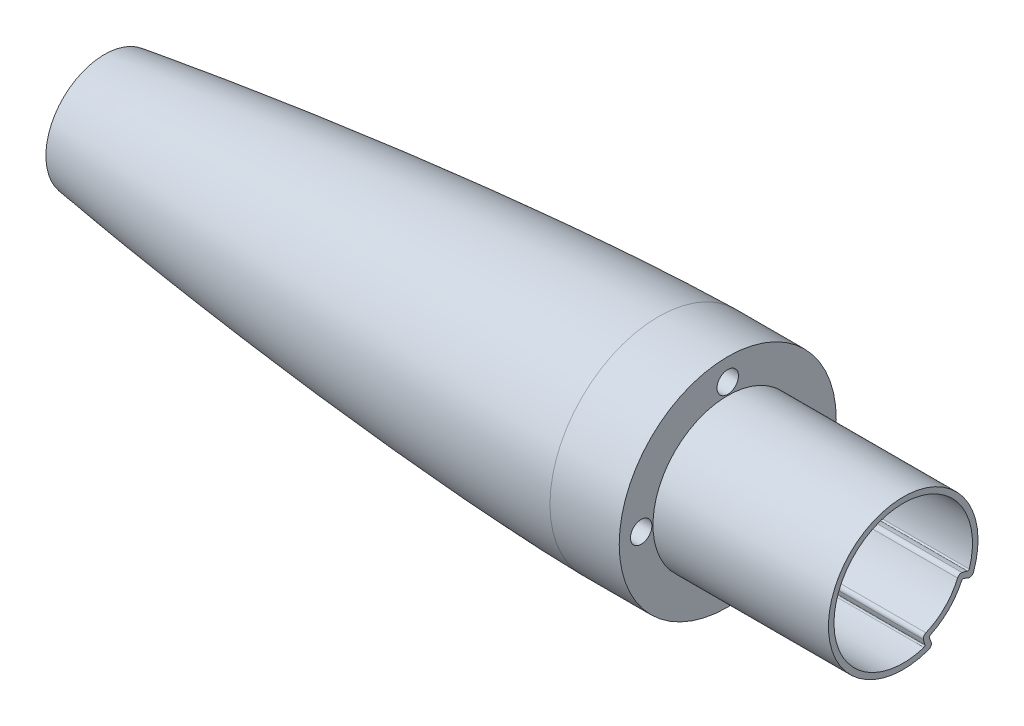
ISO-10303-21;
HEADER;
FILE_DESCRIPTION(('STEP AP214'),'2;1');
FILE_NAME('part.step','',(''),(''),'','','');
FILE_SCHEMA(('AUTOMOTIVE_DESIGN { 1 0 10303 214 1 1 1 1 }'));
ENDSEC;
DATA;
#1=APPLICATION_CONTEXT('core data for automotive mechanical design processes');
#2=APPLICATION_PROTOCOL_DEFINITION('international standard','automotive_design',2000,#1);
#3=PRODUCT_CONTEXT('',#1,'mechanical');
#4=PRODUCT('Part','Part','',(#3));
#5=PRODUCT_RELATED_PRODUCT_CATEGORY('part','',(#4));
#6=PRODUCT_DEFINITION_FORMATION('','',#4);
#7=PRODUCT_DEFINITION_CONTEXT('part definition',#1,'design');
#8=PRODUCT_DEFINITION('design','',#6,#7);
#9=PRODUCT_DEFINITION_SHAPE('','',#8);
#10=(LENGTH_UNIT() NAMED_UNIT(*) SI_UNIT(.MILLI.,.METRE.));
#11=(NAMED_UNIT(*) PLANE_ANGLE_UNIT() SI_UNIT($,.RADIAN.));
#12=(NAMED_UNIT(*) SI_UNIT($,.STERADIAN.) SOLID_ANGLE_UNIT());
#13=UNCERTAINTY_MEASURE_WITH_UNIT(LENGTH_MEASURE(1.E-05),#10,'distance_accuracy_value','');
#14=(GEOMETRIC_REPRESENTATION_CONTEXT(3) GLOBAL_UNCERTAINTY_ASSIGNED_CONTEXT((#13)) GLOBAL_UNIT_ASSIGNED_CONTEXT((#10,
#11,#12)) REPRESENTATION_CONTEXT('',''));
#15=CARTESIAN_POINT('',(0.,0.,0.));
#16=DIRECTION('',(0.,0.,1.));
#17=DIRECTION('',(1.,0.,0.));
#18=AXIS2_PLACEMENT_3D('',#15,#16,#17);
#19=CARTESIAN_POINT('',(650.,0.,0.));
#20=DIRECTION('',(-1.,0.,0.));
#21=DIRECTION('',(0.,0.,1.));
#22=AXIS2_PLACEMENT_3D('',#19,#20,#21);
#23=PLANE('',#22);
#24=CARTESIAN_POINT('',(650.,0.,0.));
#25=DIRECTION('',(1.,0.,0.));
#26=DIRECTION('',(0.,0.,-1.));
#27=AXIS2_PLACEMENT_3D('',#24,#25,#26);
#28=CIRCLE('',#27,78.36);
#29=CARTESIAN_POINT('',(650.,0.,-78.36));
#30=VERTEX_POINT('',#29);
#31=EDGE_CURVE('E276',#30,#30,#28,.T.);
#32=ORIENTED_EDGE('',*,*,#31,.T.);
#33=EDGE_LOOP('',(#32));
#34=FACE_BOUND('',#33,.T.);
#35=CARTESIAN_POINT('',(650.,6.55725473919233E-13,62.5));
#36=DIRECTION('',(1.,0.,0.));
#37=DIRECTION('',(0.,0.,-1.));
#38=AXIS2_PLACEMENT_3D('',#35,#36,#37);
#39=CIRCLE('',#38,7.75);
#40=CARTESIAN_POINT('',(650.,6.55725473919233E-13,54.75));
#41=VERTEX_POINT('',#40);
#42=EDGE_CURVE('E372',#41,#41,#39,.T.);
#43=ORIENTED_EDGE('',*,*,#42,.F.);
#44=EDGE_LOOP('',(#43));
#45=FACE_BOUND('',#44,.T.);
#46=CARTESIAN_POINT('',(650.,-62.5,4.37150315946155E-13));
#47=DIRECTION('',(1.,0.,0.));
#48=DIRECTION('',(0.,0.,-1.));
#49=AXIS2_PLACEMENT_3D('',#46,#47,#48);
#50=CIRCLE('',#49,7.75);
#51=CARTESIAN_POINT('',(650.,-62.5,-7.74999999999956));
#52=VERTEX_POINT('',#51);
#53=EDGE_CURVE('E366',#52,#52,#50,.T.);
#54=ORIENTED_EDGE('',*,*,#53,.F.);
#55=EDGE_LOOP('',(#54));
#56=FACE_BOUND('',#55,.T.);
#57=CARTESIAN_POINT('',(650.,-2.18249897321332E-13,-62.5));
#58=DIRECTION('',(1.,0.,0.));
#59=DIRECTION('',(0.,0.,-1.));
#60=AXIS2_PLACEMENT_3D('',#57,#58,#59);
#61=CIRCLE('',#60,7.75);
#62=CARTESIAN_POINT('',(650.,-2.18249897321332E-13,-70.25));
#63=VERTEX_POINT('',#62);
#64=EDGE_CURVE('E360',#63,#63,#61,.T.);
#65=ORIENTED_EDGE('',*,*,#64,.F.);
#66=EDGE_LOOP('',(#65));
#67=FACE_BOUND('',#66,.T.);
#68=CARTESIAN_POINT('',(650.,62.5,0.));
#69=DIRECTION('',(1.,0.,0.));
#70=DIRECTION('',(0.,0.,-1.));
#71=AXIS2_PLACEMENT_3D('',#68,#69,#70);
#72=CIRCLE('',#71,7.75);
#73=CARTESIAN_POINT('',(650.,62.5,-7.75));
#74=VERTEX_POINT('',#73);
#75=EDGE_CURVE('E357',#74,#74,#72,.T.);
#76=ORIENTED_EDGE('',*,*,#75,.F.);
#77=EDGE_LOOP('',(#76));
#78=FACE_BOUND('',#77,.T.);
#79=CARTESIAN_POINT('',(650.,-38.1837661840734,-38.1837661840738));
#80=DIRECTION('',(-1.,0.,0.));
#81=DIRECTION('',(0.,0.,1.));
#82=AXIS2_PLACEMENT_3D('',#79,#80,#81);
#83=CIRCLE('',#82,20.);
#84=CARTESIAN_POINT('',(650.,-20.0778520197303,-46.6794046105512));
#85=VERTEX_POINT('',#84);
#86=CARTESIAN_POINT('',(650.,-46.679404610551,-20.0778520197308));
#87=VERTEX_POINT('',#86);
#88=EDGE_CURVE('E347',#85,#87,#83,.T.);
#89=ORIENTED_EDGE('',*,*,#88,.T.);
#90=CARTESIAN_POINT('',(650.,-47.9537503745227,-17.3619648950793));
#91=DIRECTION('',(-1.,0.,0.));
#92=DIRECTION('',(0.,0.,1.));
#93=AXIS2_PLACEMENT_3D('',#90,#91,#92);
#94=CIRCLE('',#93,3.);
#95=CARTESIAN_POINT('',(650.,-50.7745592200828,-18.3832569477311));
#96=VERTEX_POINT('',#95);
#97=EDGE_CURVE('E280',#87,#96,#94,.T.);
#98=ORIENTED_EDGE('',*,*,#97,.T.);
#99=CARTESIAN_POINT('',(650.,0.,0.));
#100=DIRECTION('',(1.,0.,0.));
#101=DIRECTION('',(0.,0.,-1.));
#102=AXIS2_PLACEMENT_3D('',#99,#100,#101);
#103=CIRCLE('',#102,54.);
#104=CARTESIAN_POINT('',(650.,-18.3832569477305,-50.774559220083));
#105=VERTEX_POINT('',#104);
#106=EDGE_CURVE('E265',#105,#96,#103,.T.);
#107=ORIENTED_EDGE('',*,*,#106,.F.);
#108=CARTESIAN_POINT('',(650.,-17.3619648950788,-47.9537503745229));
#109=DIRECTION('',(-1.,0.,0.));
#110=DIRECTION('',(0.,0.,1.));
#111=AXIS2_PLACEMENT_3D('',#108,#109,#110);
#112=CIRCLE('',#111,3.);
#113=EDGE_CURVE('E300',#105,#85,#112,.T.);
#114=ORIENTED_EDGE('',*,*,#113,.T.);
#115=EDGE_LOOP('',(#89,#98,#107,#114));
#116=FACE_BOUND('',#115,.T.);
#117=ADVANCED_FACE('F42',(#34,#45,#56,#67,#78,#116),#23,.F.);
#118=CARTESIAN_POINT('',(776.72,0.,0.));
#119=DIRECTION('',(-1.,0.,0.));
#120=DIRECTION('',(0.,0.,1.));
#121=AXIS2_PLACEMENT_3D('',#118,#119,#120);
#122=PLANE('',#121);
#123=CARTESIAN_POINT('',(776.72,0.,0.));
#124=DIRECTION('',(1.,0.,0.));
#125=DIRECTION('',(0.,0.,-1.));
#126=AXIS2_PLACEMENT_3D('',#123,#124,#125);
#127=CIRCLE('',#126,54.);
#128=CARTESIAN_POINT('',(776.72,-18.3832569477305,-50.774559220083));
#129=VERTEX_POINT('',#128);
#130=CARTESIAN_POINT('',(776.72,-50.7745592200828,-18.3832569477311));
#131=VERTEX_POINT('',#130);
#132=EDGE_CURVE('E275',#129,#131,#127,.T.);
#133=ORIENTED_EDGE('',*,*,#132,.T.);
#134=CARTESIAN_POINT('',(776.72,-47.9537503745227,-17.3619648950793));
#135=DIRECTION('',(-1.,0.,0.));
#136=DIRECTION('',(0.,0.,1.));
#137=AXIS2_PLACEMENT_3D('',#134,#135,#136);
#138=CIRCLE('',#137,3.);
#139=CARTESIAN_POINT('',(776.72,-46.679404610551,-20.0778520197308));
#140=VERTEX_POINT('',#139);
#141=EDGE_CURVE('E282',#131,#140,#138,.F.);
#142=ORIENTED_EDGE('',*,*,#141,.T.);
#143=CARTESIAN_POINT('',(776.72,-38.1837661840734,-38.1837661840738));
#144=DIRECTION('',(1.,0.,0.));
#145=DIRECTION('',(0.,0.,-1.));
#146=AXIS2_PLACEMENT_3D('',#143,#144,#145);
#147=CIRCLE('',#146,20.);
#148=CARTESIAN_POINT('',(776.72,-43.4171482078619,-18.8806132656232));
#149=VERTEX_POINT('',#148);
#150=EDGE_CURVE('E340',#149,#140,#147,.T.);
#151=ORIENTED_EDGE('',*,*,#150,.F.);
#152=CARTESIAN_POINT('',(776.72,-43.1554791066725,-19.8457709115457));
#153=DIRECTION('',(-1.,0.,0.));
#154=DIRECTION('',(0.,0.,1.));
#155=AXIS2_PLACEMENT_3D('',#152,#153,#154);
#156=CIRCLE('',#155,1.);
#157=CARTESIAN_POINT('',(776.72,-42.2469427044268,-19.4279652081448));
#158=VERTEX_POINT('',#157);
#159=EDGE_CURVE('E13',#149,#158,#156,.T.);
#160=ORIENTED_EDGE('',*,*,#159,.T.);
#161=CARTESIAN_POINT('',(776.72,0.,0.));
#162=DIRECTION('',(1.,0.,0.));
#163=DIRECTION('',(0.,0.,-1.));
#164=AXIS2_PLACEMENT_3D('',#161,#162,#163);
#165=CIRCLE('',#164,46.5);
#166=CARTESIAN_POINT('',(776.72,-19.4279652081443,-42.2469427044269));
#167=VERTEX_POINT('',#166);
#168=EDGE_CURVE('E335',#158,#167,#165,.T.);
#169=ORIENTED_EDGE('',*,*,#168,.T.);
#170=CARTESIAN_POINT('',(776.72,-19.8457709115453,-43.1554791066727));
#171=DIRECTION('',(-1.,0.,0.));
#172=DIRECTION('',(0.,0.,1.));
#173=AXIS2_PLACEMENT_3D('',#170,#171,#172);
#174=CIRCLE('',#173,1.);
#175=CARTESIAN_POINT('',(776.72,-18.8806132656227,-43.4171482078621));
#176=VERTEX_POINT('',#175);
#177=EDGE_CURVE('E50',#167,#176,#174,.T.);
#178=ORIENTED_EDGE('',*,*,#177,.T.);
#179=CARTESIAN_POINT('',(776.72,-20.0778520197303,-46.6794046105512));
#180=VERTEX_POINT('',#179);
#181=EDGE_CURVE('E333',#180,#176,#147,.T.);
#182=ORIENTED_EDGE('',*,*,#181,.F.);
#183=CARTESIAN_POINT('',(776.72,-17.3619648950788,-47.9537503745229));
#184=DIRECTION('',(-1.,0.,0.));
#185=DIRECTION('',(0.,0.,1.));
#186=AXIS2_PLACEMENT_3D('',#183,#184,#185);
#187=CIRCLE('',#186,3.);
#188=EDGE_CURVE('E176',#180,#129,#187,.F.);
#189=ORIENTED_EDGE('',*,*,#188,.T.);
#190=EDGE_LOOP('',(#133,#142,#151,#160,#169,#178,#182,#189));
#191=FACE_BOUND('',#190,.T.);
#192=CARTESIAN_POINT('',(776.72,0.,0.));
#193=DIRECTION('',(1.,0.,0.));
#194=DIRECTION('',(0.,0.,-1.));
#195=AXIS2_PLACEMENT_3D('',#192,#193,#194);
#196=CIRCLE('',#195,42.5);
#197=CARTESIAN_POINT('',(776.72,-39.2186752694362,-16.3751491630005));
#198=VERTEX_POINT('',#197);
#199=CARTESIAN_POINT('',(776.72,-16.3751491630001,-39.2186752694364));
#200=VERTEX_POINT('',#199);
#201=EDGE_CURVE('E172',#198,#200,#196,.T.);
#202=ORIENTED_EDGE('',*,*,#201,.F.);
#203=CARTESIAN_POINT('',(776.72,-41.9870523472787,-17.5310420450947));
#204=DIRECTION('',(-1.,0.,0.));
#205=DIRECTION('',(0.,0.,1.));
#206=AXIS2_PLACEMENT_3D('',#203,#204,#205);
#207=CIRCLE('',#206,3.);
#208=CARTESIAN_POINT('',(776.72,-42.5303789420224,-14.5806528823834));
#209=VERTEX_POINT('',#208);
#210=EDGE_CURVE('E156',#198,#209,#207,.F.);
#211=ORIENTED_EDGE('',*,*,#210,.T.);
#212=CARTESIAN_POINT('',(776.72,-38.1837661840734,-38.1837661840738));
#213=DIRECTION('',(1.,0.,0.));
#214=DIRECTION('',(0.,0.,-1.));
#215=AXIS2_PLACEMENT_3D('',#212,#213,#214);
#216=CIRCLE('',#215,24.);
#217=CARTESIAN_POINT('',(776.72,-46.4021029100295,-15.6347320260704));
#218=VERTEX_POINT('',#217);
#219=EDGE_CURVE('E182',#209,#218,#216,.T.);
#220=ORIENTED_EDGE('',*,*,#219,.T.);
#221=CARTESIAN_POINT('',(776.72,-46.7445336069443,-14.6951889361536));
#222=DIRECTION('',(-1.,0.,0.));
#223=DIRECTION('',(0.,0.,1.));
#224=AXIS2_PLACEMENT_3D('',#221,#222,#223);
#225=CIRCLE('',#224,1.);
#226=CARTESIAN_POINT('',(776.72,-47.6985036805554,-14.9950907511772));
#227=VERTEX_POINT('',#226);
#228=EDGE_CURVE('E330',#218,#227,#225,.T.);
#229=ORIENTED_EDGE('',*,*,#228,.T.);
#230=CARTESIAN_POINT('',(776.72,0.,0.));
#231=DIRECTION('',(1.,0.,0.));
#232=DIRECTION('',(0.,0.,-1.));
#233=AXIS2_PLACEMENT_3D('',#230,#231,#232);
#234=CIRCLE('',#233,50.);
#235=CARTESIAN_POINT('',(776.72,-14.9950907511766,-47.6985036805556));
#236=VERTEX_POINT('',#235);
#237=EDGE_CURVE('E184',#236,#227,#234,.T.);
#238=ORIENTED_EDGE('',*,*,#237,.F.);
#239=CARTESIAN_POINT('',(776.72,-14.6951889361531,-46.7445336069445));
#240=DIRECTION('',(-1.,0.,0.));
#241=DIRECTION('',(0.,0.,1.));
#242=AXIS2_PLACEMENT_3D('',#239,#240,#241);
#243=CIRCLE('',#242,1.);
#244=CARTESIAN_POINT('',(776.72,-15.6347320260699,-46.4021029100297));
#245=VERTEX_POINT('',#244);
#246=EDGE_CURVE('E328',#236,#245,#243,.T.);
#247=ORIENTED_EDGE('',*,*,#246,.T.);
#248=CARTESIAN_POINT('',(776.72,-14.5806528823829,-42.5303789420225));
#249=VERTEX_POINT('',#248);
#250=EDGE_CURVE('E181',#245,#249,#216,.T.);
#251=ORIENTED_EDGE('',*,*,#250,.T.);
#252=CARTESIAN_POINT('',(776.72,-17.5310420450942,-41.9870523472789));
#253=DIRECTION('',(-1.,0.,0.));
#254=DIRECTION('',(0.,0.,1.));
#255=AXIS2_PLACEMENT_3D('',#252,#253,#254);
#256=CIRCLE('',#255,3.);
#257=EDGE_CURVE('E166',#249,#200,#256,.F.);
#258=ORIENTED_EDGE('',*,*,#257,.T.);
#259=EDGE_LOOP('',(#202,#211,#220,#229,#238,#247,#251,#258));
#260=FACE_BOUND('',#259,.T.);
#261=ADVANCED_FACE('F179',(#191,#260),#122,.F.);
#262=CARTESIAN_POINT('',(0.,0.,0.));
#263=CARTESIAN_POINT('',(0.0016487257899739,0.00637767165344409,0.));
#264=CARTESIAN_POINT('',(0.0057621718653015,0.0188021593914274,0.));
#265=CARTESIAN_POINT('',(0.0175123313243743,0.0422493817570645,0.));
#266=CARTESIAN_POINT('',(0.046253840596632,0.0861642592508907,0.));
#267=CARTESIAN_POINT('',(0.0914748777391001,0.142292386652359,0.));
#268=CARTESIAN_POINT('',(0.154274348482774,0.20912514537751,0.));
#269=CARTESIAN_POINT('',(0.276301441633623,0.324701770965458,0.));
#270=CARTESIAN_POINT('',(0.421122579930573,0.443291574190418,0.));
#271=CARTESIAN_POINT('',(0.586286455480629,0.566464418607899,0.));
#272=CARTESIAN_POINT('',(0.83951343193514,0.741034702086761,0.));
#273=CARTESIAN_POINT('',(1.18296840036321,0.960203667032714,0.));
#274=CARTESIAN_POINT('',(1.78280966033623,1.30866238394851,0.));
#275=CARTESIAN_POINT('',(2.86829695281267,1.87162382715185,0.));
#276=CARTESIAN_POINT('',(4.76277782522134,2.73974077748204,0.));
#277=CARTESIAN_POINT('',(8.19028565992219,4.11595910205271,0.));
#278=CARTESIAN_POINT('',(14.422968110472,6.28797056713511,0.));
#279=CARTESIAN_POINT('',(24.8043027546662,9.40768115367406,0.));
#280=CARTESIAN_POINT('',(38.8994962833824,13.087626071966,0.));
#281=CARTESIAN_POINT('',(55.9277376029872,17.0568128067629,0.));
#282=CARTESIAN_POINT('',(79.0908104498615,21.9783504080432,0.));
#283=CARTESIAN_POINT('',(106.881185800737,27.3295948783205,0.));
#284=CARTESIAN_POINT('',(139.404169497215,33.0214355719504,0.));
#285=CARTESIAN_POINT('',(176.668348452349,38.9538903494959,0.));
#286=CARTESIAN_POINT('',(214.003857084132,44.4168991341357,0.));
#287=CARTESIAN_POINT('',(251.396751983993,49.471116429039,0.));
#288=CARTESIAN_POINT('',(288.837779512109,54.1545255374062,0.));
#289=CARTESIAN_POINT('',(326.320734140861,58.4892815739677,0.));
#290=CARTESIAN_POINT('',(363.841177132752,62.4863121261995,0.));
#291=CARTESIAN_POINT('',(401.39599420768,66.1465092198773,0.));
#292=CARTESIAN_POINT('',(438.982971251084,69.4606087355129,0.));
#293=CARTESIAN_POINT('',(476.600652970697,72.4071093826599,0.));
#294=CARTESIAN_POINT('',(509.542265690245,74.6286978107565,0.));
#295=CARTESIAN_POINT('',(537.796481138977,76.2335046528282,0.));
#296=CARTESIAN_POINT('',(560.292262180115,77.2754594007759,0.));
#297=CARTESIAN_POINT('',(575.19535670378,77.8326432804356,0.));
#298=CARTESIAN_POINT('',(587.214225045065,78.1730067265653,0.));
#299=CARTESIAN_POINT('',(594.51997618939,78.3103558818441,0.));
#300=CARTESIAN_POINT('',(598.173256760109,78.3543246601118,0.));
#301=CARTESIAN_POINT('',(600.,78.36,0.));
#302=B_SPLINE_CURVE_WITH_KNOTS('',4,(#262,#263,#264,#265,#266,#267,#268,#269,#270,#271,#272,
#273,#274,#275,#276,#277,#278,#279,#280,#281,#282,#283,#284,#285,#286,#287,#288,#289,#290,#291,
#292,#293,#294,#295,#296,#297,#298,#299,#300,#301),.UNSPECIFIED.,.F.,.F.,(5,1,1,1,1,1,1,1,1,1,1,
1,1,1,1,1,1,1,1,1,1,1,1,1,1,1,1,1,1,1,1,1,1,1,1,1,5),(0.,4.31412316187256E-05,
8.62824632374512E-05,0.000172564926474902,0.000345129852949805,0.000517694779424707,
0.000690259705899609,0.00127990506767294,0.00157768305463857,0.0018754610416042,
0.00271726976481212,0.00396472959905857,0.00614862348380284,0.00993227852523749,
0.0164479418553174,0.028301298247299,0.0496396283350756,0.0813631631901833,0.112451510280435,
0.143539857370687,0.20571657333025,0.267893284077703,0.330069994858809,0.392246705900878,
0.454423416608389,0.516600127206857,0.578776840412764,0.640953551735382,0.703130263297214,
0.765306975424274,0.827483686980578,0.889660398581477,0.920748754835595,0.951837111089712,
0.975918555544856,0.987959277772428,1.),.UNSPECIFIED.);
#303=CARTESIAN_POINT('',(776.72,0.,0.));
#304=DIRECTION('',(1.,0.,0.));
#305=AXIS1_PLACEMENT('',#303,#304);
#306=SURFACE_OF_REVOLUTION('',#302,#305);
#307=CARTESIAN_POINT('',(600.,0.,0.));
#308=DIRECTION('',(1.,0.,0.));
#309=DIRECTION('',(0.,0.,-1.));
#310=AXIS2_PLACEMENT_3D('',#307,#308,#309);
#311=CIRCLE('',#310,78.36);
#312=CARTESIAN_POINT('',(600.,0.,-78.36));
#313=VERTEX_POINT('',#312);
#314=EDGE_CURVE('E196',#313,#313,#311,.T.);
#315=ORIENTED_EDGE('',*,*,#314,.F.);
#316=EDGE_LOOP('',(#315));
#317=FACE_BOUND('',#316,.T.);
#318=CARTESIAN_POINT('',(200.000000000004,0.,0.));
#319=DIRECTION('',(1.,0.,0.));
#320=DIRECTION('',(0.,0.,-1.));
#321=AXIS2_PLACEMENT_3D('',#318,#319,#320);
#322=CIRCLE('',#321,42.3282803701014);
#323=CARTESIAN_POINT('',(200.000000000004,0.,-42.3282803701014));
#324=VERTEX_POINT('',#323);
#325=EDGE_CURVE('E419',#324,#324,#322,.T.);
#326=ORIENTED_EDGE('',*,*,#325,.T.);
#327=EDGE_LOOP('',(#326));
#328=FACE_BOUND('',#327,.T.);
#329=ADVANCED_FACE('F202',(#317,#328),#306,.T.);
#330=CARTESIAN_POINT('',(200.000000000003,-1.70487664440081E-11,0.));
#331=DIRECTION('',(1.,0.,0.));
#332=DIRECTION('',(0.,0.,-1.));
#333=AXIS2_PLACEMENT_3D('',#330,#331,#332);
#334=PLANE('',#333);
#335=CARTESIAN_POINT('',(200.000000000003,0.,0.));
#336=DIRECTION('',(-1.,0.,0.));
#337=DIRECTION('',(0.,0.,1.));
#338=AXIS2_PLACEMENT_3D('',#335,#336,#337);
#339=CIRCLE('',#338,33.);
#340=CARTESIAN_POINT('',(200.000000000003,0.,33.));
#341=VERTEX_POINT('',#340);
#342=EDGE_CURVE('E389',#341,#341,#339,.T.);
#343=ORIENTED_EDGE('',*,*,#342,.F.);
#344=EDGE_LOOP('',(#343));
#345=FACE_BOUND('',#344,.T.);
#346=ORIENTED_EDGE('',*,*,#325,.F.);
#347=EDGE_LOOP('',(#346));
#348=FACE_BOUND('',#347,.T.);
#349=ADVANCED_FACE('F206',(#345,#348),#334,.F.);
#350=CARTESIAN_POINT('',(776.72,0.,0.));
#351=DIRECTION('',(1.,0.,0.));
#352=DIRECTION('',(0.,0.,-1.));
#353=AXIS2_PLACEMENT_3D('',#350,#351,#352);
#354=CYLINDRICAL_SURFACE('',#353,54.);
#355=ORIENTED_EDGE('',*,*,#106,.T.);
#356=DIRECTION('',(1.,0.,0.));
#357=VECTOR('',#356,1.);
#358=CARTESIAN_POINT('',(776.72,-50.7745592200828,-18.3832569477311));
#359=LINE('',#358,#357);
#360=EDGE_CURVE('E268',#96,#131,#359,.T.);
#361=ORIENTED_EDGE('',*,*,#360,.T.);
#362=ORIENTED_EDGE('',*,*,#132,.F.);
#363=DIRECTION('',(1.,0.,0.));
#364=VECTOR('',#363,1.);
#365=CARTESIAN_POINT('',(776.72,-18.3832569477305,-50.774559220083));
#366=LINE('',#365,#364);
#367=EDGE_CURVE('E271',#129,#105,#366,.F.);
#368=ORIENTED_EDGE('',*,*,#367,.T.);
#369=EDGE_LOOP('',(#355,#361,#362,#368));
#370=FACE_BOUND('',#369,.T.);
#371=ADVANCED_FACE('F252',(#370),#354,.T.);
#372=CARTESIAN_POINT('',(776.72,0.,0.));
#373=DIRECTION('',(1.,0.,0.));
#374=DIRECTION('',(0.,0.,-1.));
#375=AXIS2_PLACEMENT_3D('',#372,#373,#374);
#376=CYLINDRICAL_SURFACE('',#375,78.36);
#377=ORIENTED_EDGE('',*,*,#31,.F.);
#378=EDGE_LOOP('',(#377));
#379=FACE_BOUND('',#378,.T.);
#380=ORIENTED_EDGE('',*,*,#314,.T.);
#381=EDGE_LOOP('',(#380));
#382=FACE_BOUND('',#381,.T.);
#383=ADVANCED_FACE('F250',(#379,#382),#376,.T.);
#384=CARTESIAN_POINT('',(376.72,-38.1837661840734,-38.1837661840738));
#385=DIRECTION('',(1.,0.,0.));
#386=DIRECTION('',(0.,0.,-1.));
#387=AXIS2_PLACEMENT_3D('',#384,#385,#386);
#388=CYLINDRICAL_SURFACE('',#387,24.);
#389=CARTESIAN_POINT('',(376.72,-38.1837661840734,-38.1837661840738));
#390=DIRECTION('',(1.,0.,0.));
#391=DIRECTION('',(0.,0.,-1.));
#392=AXIS2_PLACEMENT_3D('',#389,#390,#391);
#393=CIRCLE('',#392,24.);
#394=CARTESIAN_POINT('',(376.72,-42.5303789420224,-14.5806528823834));
#395=VERTEX_POINT('',#394);
#396=CARTESIAN_POINT('',(376.72,-46.4021029100295,-15.6347320260704));
#397=VERTEX_POINT('',#396);
#398=EDGE_CURVE('E191',#395,#397,#393,.T.);
#399=ORIENTED_EDGE('',*,*,#398,.T.);
#400=DIRECTION('',(1.,0.,0.));
#401=VECTOR('',#400,1.);
#402=CARTESIAN_POINT('',(376.72,-46.4021029100295,-15.6347320260704));
#403=LINE('',#402,#401);
#404=EDGE_CURVE('E313',#397,#218,#403,.T.);
#405=ORIENTED_EDGE('',*,*,#404,.T.);
#406=ORIENTED_EDGE('',*,*,#219,.F.);
#407=DIRECTION('',(1.,0.,0.));
#408=VECTOR('',#407,1.);
#409=CARTESIAN_POINT('',(376.72,-42.5303789420224,-14.5806528823834));
#410=LINE('',#409,#408);
#411=EDGE_CURVE('E161',#209,#395,#410,.F.);
#412=ORIENTED_EDGE('',*,*,#411,.T.);
#413=EDGE_LOOP('',(#399,#405,#406,#412));
#414=FACE_BOUND('',#413,.T.);
#415=ADVANCED_FACE('F259',(#414),#388,.T.);
#416=CARTESIAN_POINT('',(376.72,0.,0.));
#417=DIRECTION('',(1.,0.,0.));
#418=DIRECTION('',(0.,0.,-1.));
#419=AXIS2_PLACEMENT_3D('',#416,#417,#418);
#420=CYLINDRICAL_SURFACE('',#419,50.);
#421=CARTESIAN_POINT('',(376.72,0.,0.));
#422=DIRECTION('',(1.,0.,0.));
#423=DIRECTION('',(0.,0.,-1.));
#424=AXIS2_PLACEMENT_3D('',#421,#422,#423);
#425=CIRCLE('',#424,50.);
#426=CARTESIAN_POINT('',(376.72,-14.9950907511766,-47.6985036805556));
#427=VERTEX_POINT('',#426);
#428=CARTESIAN_POINT('',(376.72,-47.6985036805554,-14.9950907511772));
#429=VERTEX_POINT('',#428);
#430=EDGE_CURVE('E397',#427,#429,#425,.T.);
#431=ORIENTED_EDGE('',*,*,#430,.F.);
#432=DIRECTION('',(1.,0.,0.));
#433=VECTOR('',#432,1.);
#434=CARTESIAN_POINT('',(376.72,-14.9950907511766,-47.6985036805556));
#435=LINE('',#434,#433);
#436=EDGE_CURVE('E304',#427,#236,#435,.T.);
#437=ORIENTED_EDGE('',*,*,#436,.T.);
#438=ORIENTED_EDGE('',*,*,#237,.T.);
#439=DIRECTION('',(1.,0.,0.));
#440=VECTOR('',#439,1.);
#441=CARTESIAN_POINT('',(376.72,-47.6985036805554,-14.9950907511772));
#442=LINE('',#441,#440);
#443=EDGE_CURVE('E302',#227,#429,#442,.F.);
#444=ORIENTED_EDGE('',*,*,#443,.T.);
#445=EDGE_LOOP('',(#431,#437,#438,#444));
#446=FACE_BOUND('',#445,.T.);
#447=ADVANCED_FACE('F436',(#446),#420,.F.);
#448=ORIENTED_EDGE('',*,*,#250,.F.);
#449=DIRECTION('',(1.,0.,0.));
#450=VECTOR('',#449,1.);
#451=CARTESIAN_POINT('',(376.72,-15.6347320260699,-46.4021029100297));
#452=LINE('',#451,#450);
#453=CARTESIAN_POINT('',(376.72,-15.6347320260699,-46.4021029100297));
#454=VERTEX_POINT('',#453);
#455=EDGE_CURVE('E307',#245,#454,#452,.F.);
#456=ORIENTED_EDGE('',*,*,#455,.T.);
#457=CARTESIAN_POINT('',(376.72,-14.5806528823829,-42.5303789420225));
#458=VERTEX_POINT('',#457);
#459=EDGE_CURVE('E396',#454,#458,#393,.T.);
#460=ORIENTED_EDGE('',*,*,#459,.T.);
#461=DIRECTION('',(1.,0.,0.));
#462=VECTOR('',#461,1.);
#463=CARTESIAN_POINT('',(376.72,-14.5806528823829,-42.5303789420225));
#464=LINE('',#463,#462);
#465=EDGE_CURVE('E288',#458,#249,#464,.T.);
#466=ORIENTED_EDGE('',*,*,#465,.T.);
#467=EDGE_LOOP('',(#448,#456,#460,#466));
#468=FACE_BOUND('',#467,.T.);
#469=ADVANCED_FACE('F407',(#468),#388,.T.);
#470=CARTESIAN_POINT('',(376.72,0.,0.));
#471=DIRECTION('',(1.,0.,0.));
#472=DIRECTION('',(0.,0.,-1.));
#473=AXIS2_PLACEMENT_3D('',#470,#471,#472);
#474=CYLINDRICAL_SURFACE('',#473,42.5);
#475=CARTESIAN_POINT('',(376.72,0.,0.));
#476=DIRECTION('',(1.,0.,0.));
#477=DIRECTION('',(0.,0.,-1.));
#478=AXIS2_PLACEMENT_3D('',#475,#476,#477);
#479=CIRCLE('',#478,42.5);
#480=CARTESIAN_POINT('',(376.72,-39.2186752694362,-16.3751491630005));
#481=VERTEX_POINT('',#480);
#482=CARTESIAN_POINT('',(376.72,-16.3751491630001,-39.2186752694364));
#483=VERTEX_POINT('',#482);
#484=EDGE_CURVE('E175',#481,#483,#479,.T.);
#485=ORIENTED_EDGE('',*,*,#484,.F.);
#486=DIRECTION('',(1.,0.,0.));
#487=VECTOR('',#486,1.);
#488=CARTESIAN_POINT('',(376.72,-39.2186752694362,-16.3751491630005));
#489=LINE('',#488,#487);
#490=EDGE_CURVE('E160',#481,#198,#489,.T.);
#491=ORIENTED_EDGE('',*,*,#490,.T.);
#492=ORIENTED_EDGE('',*,*,#201,.T.);
#493=DIRECTION('',(1.,0.,0.));
#494=VECTOR('',#493,1.);
#495=CARTESIAN_POINT('',(376.72,-16.3751491630001,-39.2186752694364));
#496=LINE('',#495,#494);
#497=EDGE_CURVE('E177',#200,#483,#496,.F.);
#498=ORIENTED_EDGE('',*,*,#497,.T.);
#499=EDGE_LOOP('',(#485,#491,#492,#498));
#500=FACE_BOUND('',#499,.T.);
#501=ADVANCED_FACE('F171',(#500),#474,.F.);
#502=CARTESIAN_POINT('',(376.72,0.,0.));
#503=DIRECTION('',(1.,0.,0.));
#504=DIRECTION('',(0.,0.,-1.));
#505=AXIS2_PLACEMENT_3D('',#502,#503,#504);
#506=PLANE('',#505);
#507=CARTESIAN_POINT('',(376.72,20.,0.));
#508=DIRECTION('',(1.,0.,0.));
#509=DIRECTION('',(0.,0.,-1.));
#510=AXIS2_PLACEMENT_3D('',#507,#508,#509);
#511=CIRCLE('',#510,3.1);
#512=CARTESIAN_POINT('',(376.72,20.,-3.1));
#513=VERTEX_POINT('',#512);
#514=EDGE_CURVE('E386',#513,#513,#511,.T.);
#515=ORIENTED_EDGE('',*,*,#514,.F.);
#516=EDGE_LOOP('',(#515));
#517=FACE_BOUND('',#516,.T.);
#518=CARTESIAN_POINT('',(376.72,-20.,0.));
#519=DIRECTION('',(1.,0.,0.));
#520=DIRECTION('',(0.,0.,-1.));
#521=AXIS2_PLACEMENT_3D('',#518,#519,#520);
#522=CIRCLE('',#521,3.1);
#523=CARTESIAN_POINT('',(376.72,-20.,-3.1));
#524=VERTEX_POINT('',#523);
#525=EDGE_CURVE('E380',#524,#524,#522,.T.);
#526=ORIENTED_EDGE('',*,*,#525,.F.);
#527=EDGE_LOOP('',(#526));
#528=FACE_BOUND('',#527,.T.);
#529=ORIENTED_EDGE('',*,*,#459,.F.);
#530=CARTESIAN_POINT('',(376.72,-14.6951889361531,-46.7445336069445));
#531=DIRECTION('',(1.,0.,0.));
#532=DIRECTION('',(0.,0.,-1.));
#533=AXIS2_PLACEMENT_3D('',#530,#531,#532);
#534=CIRCLE('',#533,1.);
#535=EDGE_CURVE('E311',#454,#427,#534,.T.);
#536=ORIENTED_EDGE('',*,*,#535,.T.);
#537=ORIENTED_EDGE('',*,*,#430,.T.);
#538=CARTESIAN_POINT('',(376.72,-46.7445336069443,-14.6951889361536));
#539=DIRECTION('',(1.,0.,0.));
#540=DIRECTION('',(0.,0.,-1.));
#541=AXIS2_PLACEMENT_3D('',#538,#539,#540);
#542=CIRCLE('',#541,1.);
#543=EDGE_CURVE('E309',#429,#397,#542,.T.);
#544=ORIENTED_EDGE('',*,*,#543,.T.);
#545=ORIENTED_EDGE('',*,*,#398,.F.);
#546=CARTESIAN_POINT('',(376.72,-41.9870523472787,-17.5310420450947));
#547=DIRECTION('',(1.,0.,0.));
#548=DIRECTION('',(0.,0.,-1.));
#549=AXIS2_PLACEMENT_3D('',#546,#547,#548);
#550=CIRCLE('',#549,3.);
#551=EDGE_CURVE('E294',#395,#481,#550,.F.);
#552=ORIENTED_EDGE('',*,*,#551,.T.);
#553=ORIENTED_EDGE('',*,*,#484,.T.);
#554=CARTESIAN_POINT('',(376.72,-17.5310420450942,-41.9870523472789));
#555=DIRECTION('',(1.,0.,0.));
#556=DIRECTION('',(0.,0.,-1.));
#557=AXIS2_PLACEMENT_3D('',#554,#555,#556);
#558=CIRCLE('',#557,3.);
#559=EDGE_CURVE('E296',#483,#458,#558,.F.);
#560=ORIENTED_EDGE('',*,*,#559,.T.);
#561=EDGE_LOOP('',(#529,#536,#537,#544,#545,#552,#553,#560));
#562=FACE_BOUND('',#561,.T.);
#563=ADVANCED_FACE('F412',(#517,#528,#562),#506,.T.);
#564=CARTESIAN_POINT('',(240.000000000003,0.,0.));
#565=DIRECTION('',(-1.,0.,0.));
#566=DIRECTION('',(0.,0.,1.));
#567=AXIS2_PLACEMENT_3D('',#564,#565,#566);
#568=CYLINDRICAL_SURFACE('',#567,33.);
#569=CARTESIAN_POINT('',(240.000000000003,0.,0.));
#570=DIRECTION('',(-1.,0.,0.));
#571=DIRECTION('',(0.,0.,1.));
#572=AXIS2_PLACEMENT_3D('',#569,#570,#571);
#573=CIRCLE('',#572,33.);
#574=CARTESIAN_POINT('',(240.000000000003,0.,33.));
#575=VERTEX_POINT('',#574);
#576=EDGE_CURVE('E186',#575,#575,#573,.T.);
#577=ORIENTED_EDGE('',*,*,#576,.F.);
#578=EDGE_LOOP('',(#577));
#579=FACE_BOUND('',#578,.T.);
#580=ORIENTED_EDGE('',*,*,#342,.T.);
#581=EDGE_LOOP('',(#580));
#582=FACE_BOUND('',#581,.T.);
#583=ADVANCED_FACE('F451',(#579,#582),#568,.F.);
#584=CARTESIAN_POINT('',(240.000000000003,0.,0.));
#585=DIRECTION('',(-1.,0.,0.));
#586=DIRECTION('',(0.,0.,1.));
#587=AXIS2_PLACEMENT_3D('',#584,#585,#586);
#588=PLANE('',#587);
#589=CARTESIAN_POINT('',(240.000000000003,-20.,0.));
#590=DIRECTION('',(-1.,0.,0.));
#591=DIRECTION('',(0.,0.,1.));
#592=AXIS2_PLACEMENT_3D('',#589,#590,#591);
#593=CIRCLE('',#592,3.1);
#594=CARTESIAN_POINT('',(240.000000000003,-20.,3.1));
#595=VERTEX_POINT('',#594);
#596=EDGE_CURVE('E356',#595,#595,#593,.T.);
#597=ORIENTED_EDGE('',*,*,#596,.F.);
#598=EDGE_LOOP('',(#597));
#599=FACE_BOUND('',#598,.T.);
#600=CARTESIAN_POINT('',(240.000000000003,20.,0.));
#601=DIRECTION('',(-1.,0.,0.));
#602=DIRECTION('',(0.,0.,1.));
#603=AXIS2_PLACEMENT_3D('',#600,#601,#602);
#604=CIRCLE('',#603,3.1);
#605=CARTESIAN_POINT('',(240.000000000003,20.,3.1));
#606=VERTEX_POINT('',#605);
#607=EDGE_CURVE('E383',#606,#606,#604,.T.);
#608=ORIENTED_EDGE('',*,*,#607,.F.);
#609=EDGE_LOOP('',(#608));
#610=FACE_BOUND('',#609,.T.);
#611=ORIENTED_EDGE('',*,*,#576,.T.);
#612=EDGE_LOOP('',(#611));
#613=FACE_BOUND('',#612,.T.);
#614=ADVANCED_FACE('F456',(#599,#610,#613),#588,.T.);
#615=CARTESIAN_POINT('',(776.72,-20.,0.));
#616=DIRECTION('',(-1.,0.,0.));
#617=DIRECTION('',(0.,0.,1.));
#618=AXIS2_PLACEMENT_3D('',#615,#616,#617);
#619=CYLINDRICAL_SURFACE('',#618,3.1);
#620=ORIENTED_EDGE('',*,*,#525,.T.);
#621=EDGE_LOOP('',(#620));
#622=FACE_BOUND('',#621,.T.);
#623=ORIENTED_EDGE('',*,*,#596,.T.);
#624=EDGE_LOOP('',(#623));
#625=FACE_BOUND('',#624,.T.);
#626=ADVANCED_FACE('F462',(#622,#625),#619,.F.);
#627=CARTESIAN_POINT('',(776.72,20.,0.));
#628=DIRECTION('',(-1.,0.,0.));
#629=DIRECTION('',(0.,0.,1.));
#630=AXIS2_PLACEMENT_3D('',#627,#628,#629);
#631=CYLINDRICAL_SURFACE('',#630,3.1);
#632=ORIENTED_EDGE('',*,*,#514,.T.);
#633=EDGE_LOOP('',(#632));
#634=FACE_BOUND('',#633,.T.);
#635=ORIENTED_EDGE('',*,*,#607,.T.);
#636=EDGE_LOOP('',(#635));
#637=FACE_BOUND('',#636,.T.);
#638=ADVANCED_FACE('F465',(#634,#637),#631,.F.);
#639=CARTESIAN_POINT('',(620.,6.55725473919233E-13,62.5));
#640=DIRECTION('',(1.,0.,0.));
#641=DIRECTION('',(0.,0.,-1.));
#642=AXIS2_PLACEMENT_3D('',#639,#640,#641);
#643=CYLINDRICAL_SURFACE('',#642,7.75);
#644=CARTESIAN_POINT('',(620.,6.55725473919233E-13,62.5));
#645=DIRECTION('',(1.,0.,0.));
#646=DIRECTION('',(0.,0.,-1.));
#647=AXIS2_PLACEMENT_3D('',#644,#645,#646);
#648=CIRCLE('',#647,7.75);
#649=CARTESIAN_POINT('',(620.,6.55725473919233E-13,54.75));
#650=VERTEX_POINT('',#649);
#651=EDGE_CURVE('E375',#650,#650,#648,.T.);
#652=ORIENTED_EDGE('',*,*,#651,.F.);
#653=EDGE_LOOP('',(#652));
#654=FACE_BOUND('',#653,.T.);
#655=ORIENTED_EDGE('',*,*,#42,.T.);
#656=EDGE_LOOP('',(#655));
#657=FACE_BOUND('',#656,.T.);
#658=ADVANCED_FACE('F479',(#654,#657),#643,.F.);
#659=CARTESIAN_POINT('',(620.,6.55725473919233E-13,62.5));
#660=DIRECTION('',(1.,0.,0.));
#661=DIRECTION('',(0.,0.,-1.));
#662=AXIS2_PLACEMENT_3D('',#659,#660,#661);
#663=PLANE('',#662);
#664=ORIENTED_EDGE('',*,*,#651,.T.);
#665=EDGE_LOOP('',(#664));
#666=FACE_BOUND('',#665,.T.);
#667=ADVANCED_FACE('F485',(#666),#663,.T.);
#668=CARTESIAN_POINT('',(620.,-62.5,4.37150315946155E-13));
#669=DIRECTION('',(1.,0.,0.));
#670=DIRECTION('',(0.,0.,-1.));
#671=AXIS2_PLACEMENT_3D('',#668,#669,#670);
#672=CYLINDRICAL_SURFACE('',#671,7.75);
#673=CARTESIAN_POINT('',(620.,-62.5,4.37150315946155E-13));
#674=DIRECTION('',(1.,0.,0.));
#675=DIRECTION('',(0.,0.,-1.));
#676=AXIS2_PLACEMENT_3D('',#673,#674,#675);
#677=CIRCLE('',#676,7.75);
#678=CARTESIAN_POINT('',(620.,-62.5,-7.74999999999956));
#679=VERTEX_POINT('',#678);
#680=EDGE_CURVE('E369',#679,#679,#677,.T.);
#681=ORIENTED_EDGE('',*,*,#680,.F.);
#682=EDGE_LOOP('',(#681));
#683=FACE_BOUND('',#682,.T.);
#684=ORIENTED_EDGE('',*,*,#53,.T.);
#685=EDGE_LOOP('',(#684));
#686=FACE_BOUND('',#685,.T.);
#687=ADVANCED_FACE('F490',(#683,#686),#672,.F.);
#688=CARTESIAN_POINT('',(620.,-62.5,4.37150315946155E-13));
#689=DIRECTION('',(1.,0.,0.));
#690=DIRECTION('',(0.,0.,-1.));
#691=AXIS2_PLACEMENT_3D('',#688,#689,#690);
#692=PLANE('',#691);
#693=ORIENTED_EDGE('',*,*,#680,.T.);
#694=EDGE_LOOP('',(#693));
#695=FACE_BOUND('',#694,.T.);
#696=ADVANCED_FACE('F493',(#695),#692,.T.);
#697=CARTESIAN_POINT('',(620.,-2.18249897321332E-13,-62.5));
#698=DIRECTION('',(1.,0.,0.));
#699=DIRECTION('',(0.,0.,-1.));
#700=AXIS2_PLACEMENT_3D('',#697,#698,#699);
#701=CYLINDRICAL_SURFACE('',#700,7.75);
#702=CARTESIAN_POINT('',(620.,-2.18249897321332E-13,-62.5));
#703=DIRECTION('',(1.,0.,0.));
#704=DIRECTION('',(0.,0.,-1.));
#705=AXIS2_PLACEMENT_3D('',#702,#703,#704);
#706=CIRCLE('',#705,7.75);
#707=CARTESIAN_POINT('',(620.,-2.18249897321332E-13,-70.25));
#708=VERTEX_POINT('',#707);
#709=EDGE_CURVE('E363',#708,#708,#706,.T.);
#710=ORIENTED_EDGE('',*,*,#709,.F.);
#711=EDGE_LOOP('',(#710));
#712=FACE_BOUND('',#711,.T.);
#713=ORIENTED_EDGE('',*,*,#64,.T.);
#714=EDGE_LOOP('',(#713));
#715=FACE_BOUND('',#714,.T.);
#716=ADVANCED_FACE('F496',(#712,#715),#701,.F.);
#717=CARTESIAN_POINT('',(620.,-2.18249897321332E-13,-62.5));
#718=DIRECTION('',(1.,0.,0.));
#719=DIRECTION('',(0.,0.,-1.));
#720=AXIS2_PLACEMENT_3D('',#717,#718,#719);
#721=PLANE('',#720);
#722=ORIENTED_EDGE('',*,*,#709,.T.);
#723=EDGE_LOOP('',(#722));
#724=FACE_BOUND('',#723,.T.);
#725=ADVANCED_FACE('F501',(#724),#721,.T.);
#726=CARTESIAN_POINT('',(620.,62.5,0.));
#727=DIRECTION('',(1.,0.,0.));
#728=DIRECTION('',(0.,0.,-1.));
#729=AXIS2_PLACEMENT_3D('',#726,#727,#728);
#730=CYLINDRICAL_SURFACE('',#729,7.75);
#731=CARTESIAN_POINT('',(620.,62.5,0.));
#732=DIRECTION('',(1.,0.,0.));
#733=DIRECTION('',(0.,0.,-1.));
#734=AXIS2_PLACEMENT_3D('',#731,#732,#733);
#735=CIRCLE('',#734,7.75);
#736=CARTESIAN_POINT('',(620.,62.5,-7.75));
#737=VERTEX_POINT('',#736);
#738=EDGE_CURVE('E353',#737,#737,#735,.T.);
#739=ORIENTED_EDGE('',*,*,#738,.F.);
#740=EDGE_LOOP('',(#739));
#741=FACE_BOUND('',#740,.T.);
#742=ORIENTED_EDGE('',*,*,#75,.T.);
#743=EDGE_LOOP('',(#742));
#744=FACE_BOUND('',#743,.T.);
#745=ADVANCED_FACE('F504',(#741,#744),#730,.F.);
#746=CARTESIAN_POINT('',(620.,62.5,0.));
#747=DIRECTION('',(1.,0.,0.));
#748=DIRECTION('',(0.,0.,-1.));
#749=AXIS2_PLACEMENT_3D('',#746,#747,#748);
#750=PLANE('',#749);
#751=ORIENTED_EDGE('',*,*,#738,.T.);
#752=EDGE_LOOP('',(#751));
#753=FACE_BOUND('',#752,.T.);
#754=ADVANCED_FACE('F511',(#753),#750,.T.);
#755=CARTESIAN_POINT('',(610.,0.,0.));
#756=DIRECTION('',(-1.,0.,0.));
#757=DIRECTION('',(0.,0.,1.));
#758=AXIS2_PLACEMENT_3D('',#755,#756,#757);
#759=PLANE('',#758);
#760=CARTESIAN_POINT('',(610.,-38.1837661840734,-38.1837661840738));
#761=DIRECTION('',(-1.,0.,0.));
#762=DIRECTION('',(0.,0.,1.));
#763=AXIS2_PLACEMENT_3D('',#760,#761,#762);
#764=CIRCLE('',#763,20.);
#765=CARTESIAN_POINT('',(610.,-43.4171482078619,-18.8806132656232));
#766=VERTEX_POINT('',#765);
#767=CARTESIAN_POINT('',(610.,-18.8806132656227,-43.4171482078621));
#768=VERTEX_POINT('',#767);
#769=EDGE_CURVE('E339',#766,#768,#764,.F.);
#770=ORIENTED_EDGE('',*,*,#769,.T.);
#771=CARTESIAN_POINT('',(610.,-19.8457709115453,-43.1554791066727));
#772=DIRECTION('',(-1.,0.,0.));
#773=DIRECTION('',(0.,0.,1.));
#774=AXIS2_PLACEMENT_3D('',#771,#772,#773);
#775=CIRCLE('',#774,1.);
#776=CARTESIAN_POINT('',(610.,-19.4279652081443,-42.2469427044269));
#777=VERTEX_POINT('',#776);
#778=EDGE_CURVE('E326',#768,#777,#775,.F.);
#779=ORIENTED_EDGE('',*,*,#778,.T.);
#780=CARTESIAN_POINT('',(610.,0.,0.));
#781=DIRECTION('',(-1.,0.,0.));
#782=DIRECTION('',(0.,0.,1.));
#783=AXIS2_PLACEMENT_3D('',#780,#781,#782);
#784=CIRCLE('',#783,46.5);
#785=CARTESIAN_POINT('',(610.,-42.2469427044268,-19.4279652081448));
#786=VERTEX_POINT('',#785);
#787=EDGE_CURVE('E344',#786,#777,#784,.F.);
#788=ORIENTED_EDGE('',*,*,#787,.F.);
#789=CARTESIAN_POINT('',(610.,-43.1554791066725,-19.8457709115457));
#790=DIRECTION('',(-1.,0.,0.));
#791=DIRECTION('',(0.,0.,1.));
#792=AXIS2_PLACEMENT_3D('',#789,#790,#791);
#793=CIRCLE('',#792,1.);
#794=EDGE_CURVE('E64',#786,#766,#793,.F.);
#795=ORIENTED_EDGE('',*,*,#794,.T.);
#796=EDGE_LOOP('',(#770,#779,#788,#795));
#797=FACE_BOUND('',#796,.T.);
#798=ADVANCED_FACE('F343',(#797),#759,.F.);
#799=CARTESIAN_POINT('',(526.458884211245,-38.1837661840734,-38.1837661840738));
#800=DIRECTION('',(1.,0.,0.));
#801=DIRECTION('',(0.,0.,-1.));
#802=AXIS2_PLACEMENT_3D('',#799,#800,#801);
#803=CYLINDRICAL_SURFACE('',#802,20.);
#804=ORIENTED_EDGE('',*,*,#181,.T.);
#805=DIRECTION('',(1.,0.,0.));
#806=VECTOR('',#805,1.);
#807=CARTESIAN_POINT('',(526.458884211245,-18.8806132656227,-43.4171482078621));
#808=LINE('',#807,#806);
#809=EDGE_CURVE('E57',#176,#768,#808,.F.);
#810=ORIENTED_EDGE('',*,*,#809,.T.);
#811=ORIENTED_EDGE('',*,*,#769,.F.);
#812=DIRECTION('',(1.,0.,0.));
#813=VECTOR('',#812,1.);
#814=CARTESIAN_POINT('',(526.458884211245,-43.4171482078619,-18.8806132656232));
#815=LINE('',#814,#813);
#816=EDGE_CURVE('E321',#766,#149,#815,.T.);
#817=ORIENTED_EDGE('',*,*,#816,.T.);
#818=ORIENTED_EDGE('',*,*,#150,.T.);
#819=DIRECTION('',(1.,0.,0.));
#820=VECTOR('',#819,1.);
#821=CARTESIAN_POINT('',(526.458884211245,-46.679404610551,-20.0778520197308));
#822=LINE('',#821,#820);
#823=EDGE_CURVE('E286',#140,#87,#822,.F.);
#824=ORIENTED_EDGE('',*,*,#823,.T.);
#825=ORIENTED_EDGE('',*,*,#88,.F.);
#826=DIRECTION('',(1.,0.,0.));
#827=VECTOR('',#826,1.);
#828=CARTESIAN_POINT('',(526.458884211245,-20.0778520197303,-46.6794046105512));
#829=LINE('',#828,#827);
#830=EDGE_CURVE('E283',#85,#180,#829,.T.);
#831=ORIENTED_EDGE('',*,*,#830,.T.);
#832=EDGE_LOOP('',(#804,#810,#811,#817,#818,#824,#825,#831));
#833=FACE_BOUND('',#832,.T.);
#834=ADVANCED_FACE('F337',(#833),#803,.F.);
#835=CARTESIAN_POINT('',(526.458884211245,0.,0.));
#836=DIRECTION('',(1.,0.,0.));
#837=DIRECTION('',(0.,0.,-1.));
#838=AXIS2_PLACEMENT_3D('',#835,#836,#837);
#839=CYLINDRICAL_SURFACE('',#838,46.5);
#840=ORIENTED_EDGE('',*,*,#787,.T.);
#841=DIRECTION('',(1.,0.,0.));
#842=VECTOR('',#841,1.);
#843=CARTESIAN_POINT('',(526.458884211245,-19.4279652081443,-42.246942704427));
#844=LINE('',#843,#842);
#845=EDGE_CURVE('E318',#777,#167,#844,.T.);
#846=ORIENTED_EDGE('',*,*,#845,.T.);
#847=ORIENTED_EDGE('',*,*,#168,.F.);
#848=DIRECTION('',(1.,0.,0.));
#849=VECTOR('',#848,1.);
#850=CARTESIAN_POINT('',(526.458884211245,-42.2469427044268,-19.4279652081448));
#851=LINE('',#850,#849);
#852=EDGE_CURVE('E316',#158,#786,#851,.F.);
#853=ORIENTED_EDGE('',*,*,#852,.T.);
#854=EDGE_LOOP('',(#840,#846,#847,#853));
#855=FACE_BOUND('',#854,.T.);
#856=ADVANCED_FACE('F212',(#855),#839,.T.);
#857=CARTESIAN_POINT('',(376.72,-41.9870523472787,-17.5310420450947));
#858=DIRECTION('',(-1.,0.,0.));
#859=DIRECTION('',(0.,0.,1.));
#860=AXIS2_PLACEMENT_3D('',#857,#858,#859);
#861=CYLINDRICAL_SURFACE('',#860,3.);
#862=ORIENTED_EDGE('',*,*,#551,.F.);
#863=ORIENTED_EDGE('',*,*,#411,.F.);
#864=ORIENTED_EDGE('',*,*,#210,.F.);
#865=ORIENTED_EDGE('',*,*,#490,.F.);
#866=EDGE_LOOP('',(#862,#863,#864,#865));
#867=FACE_BOUND('',#866,.T.);
#868=ADVANCED_FACE('F159',(#867),#861,.T.);
#869=CARTESIAN_POINT('',(376.72,-17.5310420450942,-41.9870523472789));
#870=DIRECTION('',(-1.,0.,0.));
#871=DIRECTION('',(0.,0.,1.));
#872=AXIS2_PLACEMENT_3D('',#869,#870,#871);
#873=CYLINDRICAL_SURFACE('',#872,3.);
#874=ORIENTED_EDGE('',*,*,#559,.F.);
#875=ORIENTED_EDGE('',*,*,#497,.F.);
#876=ORIENTED_EDGE('',*,*,#257,.F.);
#877=ORIENTED_EDGE('',*,*,#465,.F.);
#878=EDGE_LOOP('',(#874,#875,#876,#877));
#879=FACE_BOUND('',#878,.T.);
#880=ADVANCED_FACE('F211',(#879),#873,.T.);
#881=CARTESIAN_POINT('',(526.458884211245,-47.9537503745227,-17.3619648950793));
#882=DIRECTION('',(-1.,0.,0.));
#883=DIRECTION('',(0.,0.,1.));
#884=AXIS2_PLACEMENT_3D('',#881,#882,#883);
#885=CYLINDRICAL_SURFACE('',#884,3.);
#886=ORIENTED_EDGE('',*,*,#97,.F.);
#887=ORIENTED_EDGE('',*,*,#823,.F.);
#888=ORIENTED_EDGE('',*,*,#141,.F.);
#889=ORIENTED_EDGE('',*,*,#360,.F.);
#890=EDGE_LOOP('',(#886,#887,#888,#889));
#891=FACE_BOUND('',#890,.T.);
#892=ADVANCED_FACE('F215',(#891),#885,.T.);
#893=CARTESIAN_POINT('',(776.72,-17.3619648950788,-47.9537503745229));
#894=DIRECTION('',(-1.,0.,0.));
#895=DIRECTION('',(0.,0.,1.));
#896=AXIS2_PLACEMENT_3D('',#893,#894,#895);
#897=CYLINDRICAL_SURFACE('',#896,3.);
#898=ORIENTED_EDGE('',*,*,#113,.F.);
#899=ORIENTED_EDGE('',*,*,#367,.F.);
#900=ORIENTED_EDGE('',*,*,#188,.F.);
#901=ORIENTED_EDGE('',*,*,#830,.F.);
#902=EDGE_LOOP('',(#898,#899,#900,#901));
#903=FACE_BOUND('',#902,.T.);
#904=ADVANCED_FACE('F219',(#903),#897,.T.);
#905=CARTESIAN_POINT('',(376.72,-14.6951889361531,-46.7445336069445));
#906=DIRECTION('',(1.,0.,0.));
#907=DIRECTION('',(0.,0.,-1.));
#908=AXIS2_PLACEMENT_3D('',#905,#906,#907);
#909=CYLINDRICAL_SURFACE('',#908,1.);
#910=ORIENTED_EDGE('',*,*,#535,.F.);
#911=ORIENTED_EDGE('',*,*,#455,.F.);
#912=ORIENTED_EDGE('',*,*,#246,.F.);
#913=ORIENTED_EDGE('',*,*,#436,.F.);
#914=EDGE_LOOP('',(#910,#911,#912,#913));
#915=FACE_BOUND('',#914,.T.);
#916=ADVANCED_FACE('F223',(#915),#909,.F.);
#917=CARTESIAN_POINT('',(376.72,-46.7445336069443,-14.6951889361536));
#918=DIRECTION('',(1.,0.,0.));
#919=DIRECTION('',(0.,0.,-1.));
#920=AXIS2_PLACEMENT_3D('',#917,#918,#919);
#921=CYLINDRICAL_SURFACE('',#920,1.);
#922=ORIENTED_EDGE('',*,*,#543,.F.);
#923=ORIENTED_EDGE('',*,*,#443,.F.);
#924=ORIENTED_EDGE('',*,*,#228,.F.);
#925=ORIENTED_EDGE('',*,*,#404,.F.);
#926=EDGE_LOOP('',(#922,#923,#924,#925));
#927=FACE_BOUND('',#926,.T.);
#928=ADVANCED_FACE('F227',(#927),#921,.F.);
#929=CARTESIAN_POINT('',(526.458884211245,-19.8457709115453,-43.1554791066727));
#930=DIRECTION('',(1.,0.,0.));
#931=DIRECTION('',(0.,0.,-1.));
#932=AXIS2_PLACEMENT_3D('',#929,#930,#931);
#933=CYLINDRICAL_SURFACE('',#932,1.);
#934=ORIENTED_EDGE('',*,*,#778,.F.);
#935=ORIENTED_EDGE('',*,*,#809,.F.);
#936=ORIENTED_EDGE('',*,*,#177,.F.);
#937=ORIENTED_EDGE('',*,*,#845,.F.);
#938=EDGE_LOOP('',(#934,#935,#936,#937));
#939=FACE_BOUND('',#938,.T.);
#940=ADVANCED_FACE('F230',(#939),#933,.F.);
#941=CARTESIAN_POINT('',(526.458884211245,-43.1554791066725,-19.8457709115457));
#942=DIRECTION('',(1.,0.,0.));
#943=DIRECTION('',(0.,0.,-1.));
#944=AXIS2_PLACEMENT_3D('',#941,#942,#943);
#945=CYLINDRICAL_SURFACE('',#944,1.);
#946=ORIENTED_EDGE('',*,*,#794,.F.);
#947=ORIENTED_EDGE('',*,*,#852,.F.);
#948=ORIENTED_EDGE('',*,*,#159,.F.);
#949=ORIENTED_EDGE('',*,*,#816,.F.);
#950=EDGE_LOOP('',(#946,#947,#948,#949));
#951=FACE_BOUND('',#950,.T.);
#952=ADVANCED_FACE('F44',(#951),#945,.F.);
#953=CLOSED_SHELL('',(#117,#261,#329,#349,#371,#383,#415,#447,#469,#501,#563,#583,#614,#626,
#638,#658,#667,#687,#696,#716,#725,#745,#754,#798,#834,#856,#868,#880,#892,#904,#916,#928,#940,#952));
#954=MANIFOLD_SOLID_BREP('B2',#953);
#955=ADVANCED_BREP_SHAPE_REPRESENTATION('',(#18,#954),#14);
#956=SHAPE_DEFINITION_REPRESENTATION(#9,#955);
ENDSEC;
END-ISO-10303-21;
